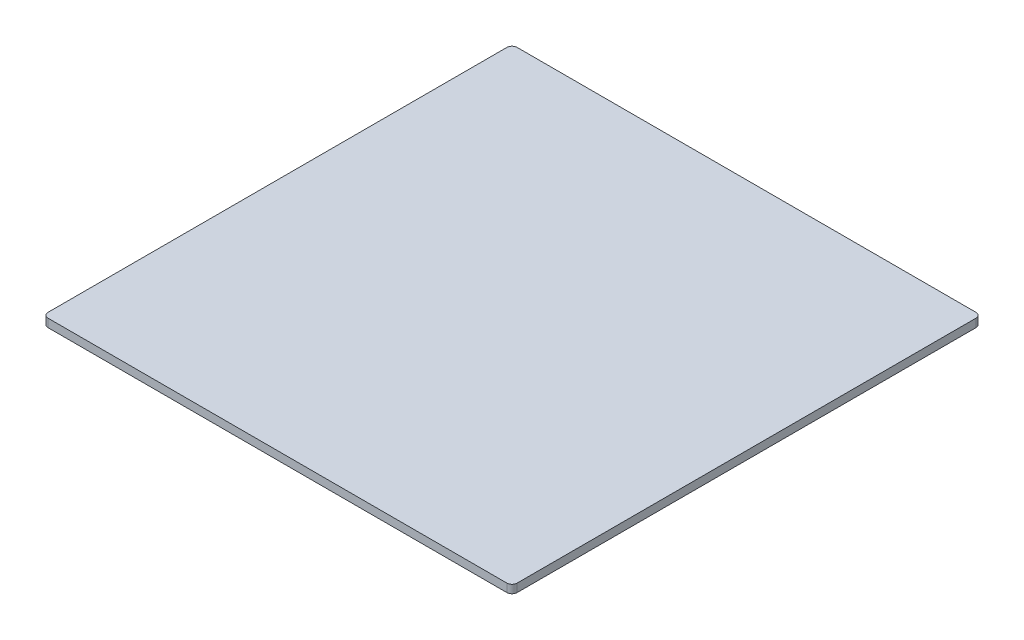
ISO-10303-21;
HEADER;
FILE_DESCRIPTION(('STEP AP214'),'2;1');
FILE_NAME('part.step','',(''),(''),'','','');
FILE_SCHEMA(('AUTOMOTIVE_DESIGN { 1 0 10303 214 1 1 1 1 }'));
ENDSEC;
DATA;
#1=APPLICATION_CONTEXT('core data for automotive mechanical design processes');
#2=APPLICATION_PROTOCOL_DEFINITION('international standard','automotive_design',2000,#1);
#3=PRODUCT_CONTEXT('',#1,'mechanical');
#4=PRODUCT('Part','Part','',(#3));
#5=PRODUCT_RELATED_PRODUCT_CATEGORY('part','',(#4));
#6=PRODUCT_DEFINITION_FORMATION('','',#4);
#7=PRODUCT_DEFINITION_CONTEXT('part definition',#1,'design');
#8=PRODUCT_DEFINITION('design','',#6,#7);
#9=PRODUCT_DEFINITION_SHAPE('','',#8);
#10=(LENGTH_UNIT() NAMED_UNIT(*) SI_UNIT(.MILLI.,.METRE.));
#11=(NAMED_UNIT(*) PLANE_ANGLE_UNIT() SI_UNIT($,.RADIAN.));
#12=(NAMED_UNIT(*) SI_UNIT($,.STERADIAN.) SOLID_ANGLE_UNIT());
#13=UNCERTAINTY_MEASURE_WITH_UNIT(LENGTH_MEASURE(1.E-05),#10,'distance_accuracy_value','');
#14=(GEOMETRIC_REPRESENTATION_CONTEXT(3) GLOBAL_UNCERTAINTY_ASSIGNED_CONTEXT((#13)) GLOBAL_UNIT_ASSIGNED_CONTEXT((#10,
#11,#12)) REPRESENTATION_CONTEXT('',''));
#15=CARTESIAN_POINT('',(0.,0.,0.));
#16=DIRECTION('',(0.,0.,1.));
#17=DIRECTION('',(1.,0.,0.));
#18=AXIS2_PLACEMENT_3D('',#15,#16,#17);
#19=CARTESIAN_POINT('',(-44.5,-1.6,-45.5));
#20=DIRECTION('',(0.,0.,1.));
#21=DIRECTION('',(1.,0.,0.));
#22=AXIS2_PLACEMENT_3D('',#19,#20,#21);
#23=PLANE('',#22);
#24=DIRECTION('',(1.,0.,0.));
#25=VECTOR('',#24,1.);
#26=CARTESIAN_POINT('',(-44.5,0.,-45.5));
#27=LINE('',#26,#25);
#28=CARTESIAN_POINT('',(-44.5,0.,-45.5));
#29=VERTEX_POINT('',#28);
#30=CARTESIAN_POINT('',(44.5,0.,-45.5));
#31=VERTEX_POINT('',#30);
#32=EDGE_CURVE('E137',#29,#31,#27,.T.);
#33=ORIENTED_EDGE('',*,*,#32,.T.);
#34=DIRECTION('',(0.,1.,0.));
#35=VECTOR('',#34,1.);
#36=CARTESIAN_POINT('',(44.5,-1.6,-45.5));
#37=LINE('',#36,#35);
#38=CARTESIAN_POINT('',(44.5,-1.6,-45.5));
#39=VERTEX_POINT('',#38);
#40=EDGE_CURVE('E11',#39,#31,#37,.T.);
#41=ORIENTED_EDGE('',*,*,#40,.F.);
#42=DIRECTION('',(1.,0.,0.));
#43=VECTOR('',#42,1.);
#44=CARTESIAN_POINT('',(-44.5,-1.6,-45.5));
#45=LINE('',#44,#43);
#46=CARTESIAN_POINT('',(-44.5,-1.6,-45.5));
#47=VERTEX_POINT('',#46);
#48=EDGE_CURVE('E155',#47,#39,#45,.T.);
#49=ORIENTED_EDGE('',*,*,#48,.F.);
#50=DIRECTION('',(0.,1.,0.));
#51=VECTOR('',#50,1.);
#52=CARTESIAN_POINT('',(-44.5,-1.6,-45.5));
#53=LINE('',#52,#51);
#54=EDGE_CURVE('E133',#47,#29,#53,.T.);
#55=ORIENTED_EDGE('',*,*,#54,.T.);
#56=EDGE_LOOP('',(#33,#41,#49,#55));
#57=FACE_BOUND('',#56,.T.);
#58=ADVANCED_FACE('F41',(#57),#23,.F.);
#59=CARTESIAN_POINT('',(44.5,-1.6,-44.5));
#60=DIRECTION('',(0.,1.,0.));
#61=DIRECTION('',(0.,0.,1.));
#62=AXIS2_PLACEMENT_3D('',#59,#60,#61);
#63=CYLINDRICAL_SURFACE('',#62,1.);
#64=CARTESIAN_POINT('',(44.5,0.,-44.5));
#65=DIRECTION('',(0.,-1.,0.));
#66=DIRECTION('',(0.,0.,-1.));
#67=AXIS2_PLACEMENT_3D('',#64,#65,#66);
#68=CIRCLE('',#67,1.);
#69=CARTESIAN_POINT('',(45.5,0.,-44.5));
#70=VERTEX_POINT('',#69);
#71=EDGE_CURVE('E140',#31,#70,#68,.T.);
#72=ORIENTED_EDGE('',*,*,#71,.T.);
#73=DIRECTION('',(0.,1.,0.));
#74=VECTOR('',#73,1.);
#75=CARTESIAN_POINT('',(45.5,-1.6,-44.5));
#76=LINE('',#75,#74);
#77=CARTESIAN_POINT('',(45.5,-1.6,-44.5));
#78=VERTEX_POINT('',#77);
#79=EDGE_CURVE('E49',#78,#70,#76,.T.);
#80=ORIENTED_EDGE('',*,*,#79,.F.);
#81=CARTESIAN_POINT('',(44.5,-1.6,-44.5));
#82=DIRECTION('',(0.,-1.,0.));
#83=DIRECTION('',(0.,0.,-1.));
#84=AXIS2_PLACEMENT_3D('',#81,#82,#83);
#85=CIRCLE('',#84,1.);
#86=EDGE_CURVE('E100',#39,#78,#85,.T.);
#87=ORIENTED_EDGE('',*,*,#86,.F.);
#88=ORIENTED_EDGE('',*,*,#40,.T.);
#89=EDGE_LOOP('',(#72,#80,#87,#88));
#90=FACE_BOUND('',#89,.T.);
#91=ADVANCED_FACE('F168',(#90),#63,.T.);
#92=CARTESIAN_POINT('',(45.5,-1.6,44.5));
#93=DIRECTION('',(1.,0.,0.));
#94=DIRECTION('',(0.,0.,-1.));
#95=AXIS2_PLACEMENT_3D('',#92,#93,#94);
#96=PLANE('',#95);
#97=DIRECTION('',(0.,0.,-1.));
#98=VECTOR('',#97,1.);
#99=CARTESIAN_POINT('',(45.5,0.,44.5));
#100=LINE('',#99,#98);
#101=CARTESIAN_POINT('',(45.5,0.,44.5));
#102=VERTEX_POINT('',#101);
#103=EDGE_CURVE('E143',#102,#70,#100,.T.);
#104=ORIENTED_EDGE('',*,*,#103,.F.);
#105=DIRECTION('',(0.,1.,0.));
#106=VECTOR('',#105,1.);
#107=CARTESIAN_POINT('',(45.5,-1.6,44.5));
#108=LINE('',#107,#106);
#109=CARTESIAN_POINT('',(45.5,-1.6,44.5));
#110=VERTEX_POINT('',#109);
#111=EDGE_CURVE('E161',#110,#102,#108,.T.);
#112=ORIENTED_EDGE('',*,*,#111,.F.);
#113=DIRECTION('',(0.,0.,-1.));
#114=VECTOR('',#113,1.);
#115=CARTESIAN_POINT('',(45.5,-1.6,44.5));
#116=LINE('',#115,#114);
#117=EDGE_CURVE('E167',#110,#78,#116,.T.);
#118=ORIENTED_EDGE('',*,*,#117,.T.);
#119=ORIENTED_EDGE('',*,*,#79,.T.);
#120=EDGE_LOOP('',(#104,#112,#118,#119));
#121=FACE_BOUND('',#120,.T.);
#122=ADVANCED_FACE('F165',(#121),#96,.T.);
#123=CARTESIAN_POINT('',(44.5,-1.6,44.5));
#124=DIRECTION('',(0.,1.,0.));
#125=DIRECTION('',(0.,0.,1.));
#126=AXIS2_PLACEMENT_3D('',#123,#124,#125);
#127=CYLINDRICAL_SURFACE('',#126,1.);
#128=CARTESIAN_POINT('',(44.5,0.,44.5));
#129=DIRECTION('',(0.,1.,0.));
#130=DIRECTION('',(0.,0.,1.));
#131=AXIS2_PLACEMENT_3D('',#128,#129,#130);
#132=CIRCLE('',#131,1.);
#133=CARTESIAN_POINT('',(44.5,0.,45.5));
#134=VERTEX_POINT('',#133);
#135=EDGE_CURVE('E146',#134,#102,#132,.T.);
#136=ORIENTED_EDGE('',*,*,#135,.F.);
#137=DIRECTION('',(0.,1.,0.));
#138=VECTOR('',#137,1.);
#139=CARTESIAN_POINT('',(44.5,-1.6,45.5));
#140=LINE('',#139,#138);
#141=CARTESIAN_POINT('',(44.5,-1.6,45.5));
#142=VERTEX_POINT('',#141);
#143=EDGE_CURVE('E159',#142,#134,#140,.T.);
#144=ORIENTED_EDGE('',*,*,#143,.F.);
#145=CARTESIAN_POINT('',(44.5,-1.6,44.5));
#146=DIRECTION('',(0.,1.,0.));
#147=DIRECTION('',(0.,0.,1.));
#148=AXIS2_PLACEMENT_3D('',#145,#146,#147);
#149=CIRCLE('',#148,1.);
#150=EDGE_CURVE('E178',#142,#110,#149,.T.);
#151=ORIENTED_EDGE('',*,*,#150,.T.);
#152=ORIENTED_EDGE('',*,*,#111,.T.);
#153=EDGE_LOOP('',(#136,#144,#151,#152));
#154=FACE_BOUND('',#153,.T.);
#155=ADVANCED_FACE('F176',(#154),#127,.T.);
#156=CARTESIAN_POINT('',(-44.5,-1.6,45.5));
#157=DIRECTION('',(0.,0.,1.));
#158=DIRECTION('',(1.,0.,0.));
#159=AXIS2_PLACEMENT_3D('',#156,#157,#158);
#160=PLANE('',#159);
#161=DIRECTION('',(1.,0.,0.));
#162=VECTOR('',#161,1.);
#163=CARTESIAN_POINT('',(-44.5,0.,45.5));
#164=LINE('',#163,#162);
#165=CARTESIAN_POINT('',(-44.5,0.,45.5));
#166=VERTEX_POINT('',#165);
#167=EDGE_CURVE('E149',#166,#134,#164,.T.);
#168=ORIENTED_EDGE('',*,*,#167,.F.);
#169=DIRECTION('',(0.,1.,0.));
#170=VECTOR('',#169,1.);
#171=CARTESIAN_POINT('',(-44.5,-1.6,45.5));
#172=LINE('',#171,#170);
#173=CARTESIAN_POINT('',(-44.5,-1.6,45.5));
#174=VERTEX_POINT('',#173);
#175=EDGE_CURVE('E128',#174,#166,#172,.T.);
#176=ORIENTED_EDGE('',*,*,#175,.F.);
#177=DIRECTION('',(1.,0.,0.));
#178=VECTOR('',#177,1.);
#179=CARTESIAN_POINT('',(-44.5,-1.6,45.5));
#180=LINE('',#179,#178);
#181=EDGE_CURVE('E121',#174,#142,#180,.T.);
#182=ORIENTED_EDGE('',*,*,#181,.T.);
#183=ORIENTED_EDGE('',*,*,#143,.T.);
#184=EDGE_LOOP('',(#168,#176,#182,#183));
#185=FACE_BOUND('',#184,.T.);
#186=ADVANCED_FACE('F184',(#185),#160,.T.);
#187=CARTESIAN_POINT('',(-44.5,-1.6,44.5));
#188=DIRECTION('',(0.,1.,0.));
#189=DIRECTION('',(0.,0.,1.));
#190=AXIS2_PLACEMENT_3D('',#187,#188,#189);
#191=CYLINDRICAL_SURFACE('',#190,1.);
#192=CARTESIAN_POINT('',(-44.5,0.,44.5));
#193=DIRECTION('',(0.,-1.,0.));
#194=DIRECTION('',(0.,0.,-1.));
#195=AXIS2_PLACEMENT_3D('',#192,#193,#194);
#196=CIRCLE('',#195,1.);
#197=CARTESIAN_POINT('',(-45.5,0.,44.5));
#198=VERTEX_POINT('',#197);
#199=EDGE_CURVE('E127',#166,#198,#196,.T.);
#200=ORIENTED_EDGE('',*,*,#199,.T.);
#201=DIRECTION('',(0.,1.,0.));
#202=VECTOR('',#201,1.);
#203=CARTESIAN_POINT('',(-45.5,-1.6,44.5));
#204=LINE('',#203,#202);
#205=CARTESIAN_POINT('',(-45.5,-1.6,44.5));
#206=VERTEX_POINT('',#205);
#207=EDGE_CURVE('E124',#206,#198,#204,.T.);
#208=ORIENTED_EDGE('',*,*,#207,.F.);
#209=CARTESIAN_POINT('',(-44.5,-1.6,44.5));
#210=DIRECTION('',(0.,-1.,0.));
#211=DIRECTION('',(0.,0.,-1.));
#212=AXIS2_PLACEMENT_3D('',#209,#210,#211);
#213=CIRCLE('',#212,1.);
#214=EDGE_CURVE('E114',#174,#206,#213,.T.);
#215=ORIENTED_EDGE('',*,*,#214,.F.);
#216=ORIENTED_EDGE('',*,*,#175,.T.);
#217=EDGE_LOOP('',(#200,#208,#215,#216));
#218=FACE_BOUND('',#217,.T.);
#219=ADVANCED_FACE('F125',(#218),#191,.T.);
#220=CARTESIAN_POINT('',(-45.5,-1.6,44.5));
#221=DIRECTION('',(1.,0.,0.));
#222=DIRECTION('',(0.,0.,-1.));
#223=AXIS2_PLACEMENT_3D('',#220,#221,#222);
#224=PLANE('',#223);
#225=DIRECTION('',(0.,0.,-1.));
#226=VECTOR('',#225,1.);
#227=CARTESIAN_POINT('',(-45.5,0.,44.5));
#228=LINE('',#227,#226);
#229=CARTESIAN_POINT('',(-45.5,0.,-44.5));
#230=VERTEX_POINT('',#229);
#231=EDGE_CURVE('E86',#198,#230,#228,.T.);
#232=ORIENTED_EDGE('',*,*,#231,.T.);
#233=DIRECTION('',(0.,1.,0.));
#234=VECTOR('',#233,1.);
#235=CARTESIAN_POINT('',(-45.5,-1.6,-44.5));
#236=LINE('',#235,#234);
#237=CARTESIAN_POINT('',(-45.5,-1.6,-44.5));
#238=VERTEX_POINT('',#237);
#239=EDGE_CURVE('E129',#238,#230,#236,.T.);
#240=ORIENTED_EDGE('',*,*,#239,.F.);
#241=DIRECTION('',(0.,0.,-1.));
#242=VECTOR('',#241,1.);
#243=CARTESIAN_POINT('',(-45.5,-1.6,44.5));
#244=LINE('',#243,#242);
#245=EDGE_CURVE('E118',#206,#238,#244,.T.);
#246=ORIENTED_EDGE('',*,*,#245,.F.);
#247=ORIENTED_EDGE('',*,*,#207,.T.);
#248=EDGE_LOOP('',(#232,#240,#246,#247));
#249=FACE_BOUND('',#248,.T.);
#250=ADVANCED_FACE('F131',(#249),#224,.F.);
#251=CARTESIAN_POINT('',(-44.5,-1.6,-44.5));
#252=DIRECTION('',(0.,1.,0.));
#253=DIRECTION('',(0.,0.,1.));
#254=AXIS2_PLACEMENT_3D('',#251,#252,#253);
#255=CYLINDRICAL_SURFACE('',#254,1.);
#256=CARTESIAN_POINT('',(-44.5,0.,-44.5));
#257=DIRECTION('',(0.,-1.,0.));
#258=DIRECTION('',(0.,0.,-1.));
#259=AXIS2_PLACEMENT_3D('',#256,#257,#258);
#260=CIRCLE('',#259,1.);
#261=EDGE_CURVE('E92',#230,#29,#260,.T.);
#262=ORIENTED_EDGE('',*,*,#261,.T.);
#263=ORIENTED_EDGE('',*,*,#54,.F.);
#264=CARTESIAN_POINT('',(-44.5,-1.6,-44.5));
#265=DIRECTION('',(0.,-1.,0.));
#266=DIRECTION('',(0.,0.,-1.));
#267=AXIS2_PLACEMENT_3D('',#264,#265,#266);
#268=CIRCLE('',#267,1.);
#269=EDGE_CURVE('E57',#238,#47,#268,.T.);
#270=ORIENTED_EDGE('',*,*,#269,.F.);
#271=ORIENTED_EDGE('',*,*,#239,.T.);
#272=EDGE_LOOP('',(#262,#263,#270,#271));
#273=FACE_BOUND('',#272,.T.);
#274=ADVANCED_FACE('F187',(#273),#255,.T.);
#275=CARTESIAN_POINT('',(44.5,-1.6,-44.5));
#276=DIRECTION('',(0.,-1.,0.));
#277=DIRECTION('',(0.,0.,-1.));
#278=AXIS2_PLACEMENT_3D('',#275,#276,#277);
#279=PLANE('',#278);
#280=ORIENTED_EDGE('',*,*,#48,.T.);
#281=ORIENTED_EDGE('',*,*,#86,.T.);
#282=ORIENTED_EDGE('',*,*,#117,.F.);
#283=ORIENTED_EDGE('',*,*,#150,.F.);
#284=ORIENTED_EDGE('',*,*,#181,.F.);
#285=ORIENTED_EDGE('',*,*,#214,.T.);
#286=ORIENTED_EDGE('',*,*,#245,.T.);
#287=ORIENTED_EDGE('',*,*,#269,.T.);
#288=EDGE_LOOP('',(#280,#281,#282,#283,#284,#285,#286,#287));
#289=FACE_BOUND('',#288,.T.);
#290=ADVANCED_FACE('F116',(#289),#279,.T.);
#291=CARTESIAN_POINT('',(44.5,0.,-44.5));
#292=DIRECTION('',(0.,-1.,0.));
#293=DIRECTION('',(0.,0.,-1.));
#294=AXIS2_PLACEMENT_3D('',#291,#292,#293);
#295=PLANE('',#294);
#296=ORIENTED_EDGE('',*,*,#32,.F.);
#297=ORIENTED_EDGE('',*,*,#261,.F.);
#298=ORIENTED_EDGE('',*,*,#231,.F.);
#299=ORIENTED_EDGE('',*,*,#199,.F.);
#300=ORIENTED_EDGE('',*,*,#167,.T.);
#301=ORIENTED_EDGE('',*,*,#135,.T.);
#302=ORIENTED_EDGE('',*,*,#103,.T.);
#303=ORIENTED_EDGE('',*,*,#71,.F.);
#304=EDGE_LOOP('',(#296,#297,#298,#299,#300,#301,#302,#303));
#305=FACE_BOUND('',#304,.T.);
#306=ADVANCED_FACE('F172',(#305),#295,.F.);
#307=CLOSED_SHELL('',(#58,#91,#122,#155,#186,#219,#250,#274,#290,#306));
#308=MANIFOLD_SOLID_BREP('B2',#307);
#309=ADVANCED_BREP_SHAPE_REPRESENTATION('',(#18,#308),#14);
#310=SHAPE_DEFINITION_REPRESENTATION(#9,#309);
ENDSEC;
END-ISO-10303-21;
